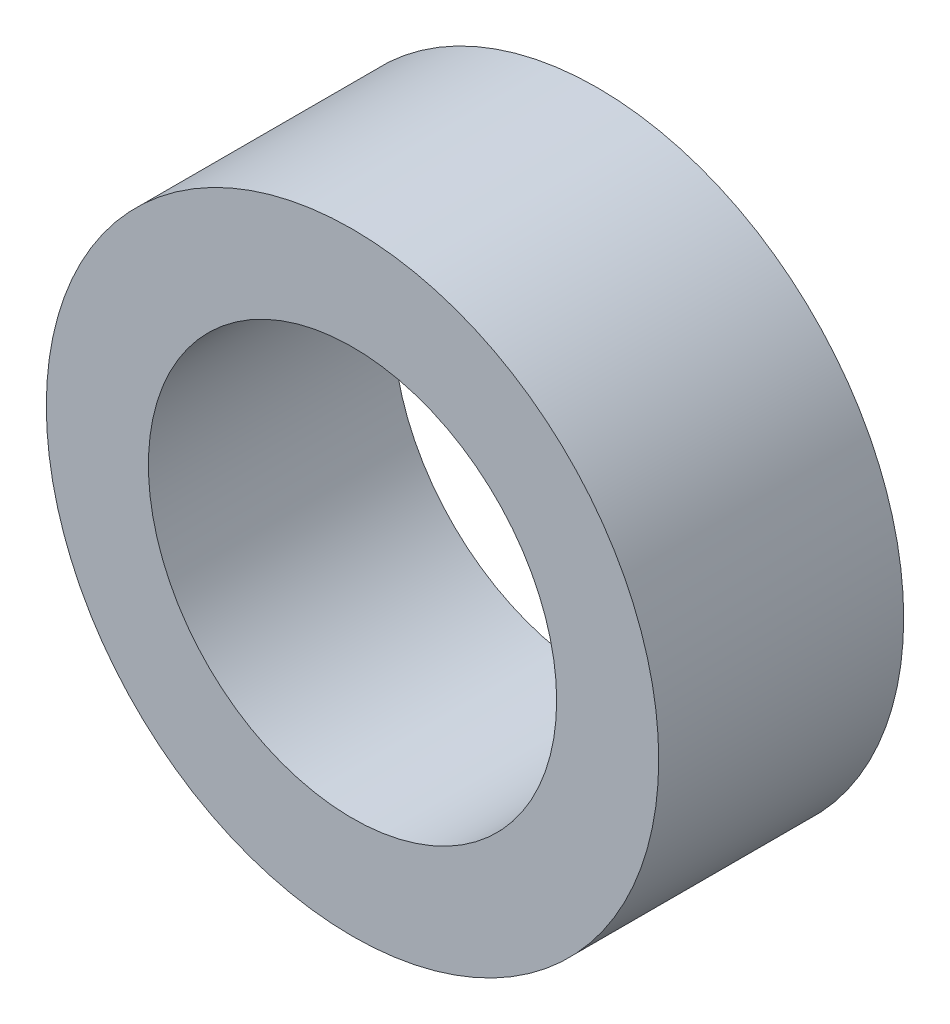
ISO-10303-21;
HEADER;
FILE_DESCRIPTION(('STEP AP214'),'2;1');
FILE_NAME('part.step','',(''),(''),'','','');
FILE_SCHEMA(('AUTOMOTIVE_DESIGN { 1 0 10303 214 1 1 1 1 }'));
ENDSEC;
DATA;
#1=APPLICATION_CONTEXT('core data for automotive mechanical design processes');
#2=APPLICATION_PROTOCOL_DEFINITION('international standard','automotive_design',2000,#1);
#3=PRODUCT_CONTEXT('',#1,'mechanical');
#4=PRODUCT('Part','Part','',(#3));
#5=PRODUCT_RELATED_PRODUCT_CATEGORY('part','',(#4));
#6=PRODUCT_DEFINITION_FORMATION('','',#4);
#7=PRODUCT_DEFINITION_CONTEXT('part definition',#1,'design');
#8=PRODUCT_DEFINITION('design','',#6,#7);
#9=PRODUCT_DEFINITION_SHAPE('','',#8);
#10=(LENGTH_UNIT() NAMED_UNIT(*) SI_UNIT(.MILLI.,.METRE.));
#11=(NAMED_UNIT(*) PLANE_ANGLE_UNIT() SI_UNIT($,.RADIAN.));
#12=(NAMED_UNIT(*) SI_UNIT($,.STERADIAN.) SOLID_ANGLE_UNIT());
#13=UNCERTAINTY_MEASURE_WITH_UNIT(LENGTH_MEASURE(1.E-05),#10,'distance_accuracy_value','');
#14=(GEOMETRIC_REPRESENTATION_CONTEXT(3) GLOBAL_UNCERTAINTY_ASSIGNED_CONTEXT((#13)) GLOBAL_UNIT_ASSIGNED_CONTEXT((#10,
#11,#12)) REPRESENTATION_CONTEXT('',''));
#15=CARTESIAN_POINT('',(0.,0.,0.));
#16=DIRECTION('',(0.,0.,1.));
#17=DIRECTION('',(1.,0.,0.));
#18=AXIS2_PLACEMENT_3D('',#15,#16,#17);
#19=CARTESIAN_POINT('',(0.,0.,1.5));
#20=DIRECTION('',(0.,0.,1.));
#21=DIRECTION('',(1.,0.,0.));
#22=AXIS2_PLACEMENT_3D('',#19,#20,#21);
#23=PLANE('',#22);
#24=CARTESIAN_POINT('',(0.,0.,1.5));
#25=DIRECTION('',(0.,0.,1.));
#26=DIRECTION('',(1.,0.,0.));
#27=AXIS2_PLACEMENT_3D('',#24,#25,#26);
#28=CIRCLE('',#27,3.75);
#29=CARTESIAN_POINT('',(3.75,0.,1.5));
#30=VERTEX_POINT('',#29);
#31=EDGE_CURVE('E10',#30,#30,#28,.T.);
#32=ORIENTED_EDGE('',*,*,#31,.T.);
#33=EDGE_LOOP('',(#32));
#34=FACE_BOUND('',#33,.T.);
#35=CARTESIAN_POINT('',(0.,0.,1.5));
#36=DIRECTION('',(0.,0.,1.));
#37=DIRECTION('',(1.,0.,0.));
#38=AXIS2_PLACEMENT_3D('',#35,#36,#37);
#39=CIRCLE('',#38,2.5);
#40=CARTESIAN_POINT('',(2.5,0.,1.5));
#41=VERTEX_POINT('',#40);
#42=EDGE_CURVE('E50',#41,#41,#39,.T.);
#43=ORIENTED_EDGE('',*,*,#42,.F.);
#44=EDGE_LOOP('',(#43));
#45=FACE_BOUND('',#44,.T.);
#46=ADVANCED_FACE('F37',(#34,#45),#23,.T.);
#47=CARTESIAN_POINT('',(0.,0.,-1.5));
#48=DIRECTION('',(0.,0.,1.));
#49=DIRECTION('',(1.,0.,0.));
#50=AXIS2_PLACEMENT_3D('',#47,#48,#49);
#51=PLANE('',#50);
#52=CARTESIAN_POINT('',(0.,0.,-1.5));
#53=DIRECTION('',(0.,0.,1.));
#54=DIRECTION('',(1.,0.,0.));
#55=AXIS2_PLACEMENT_3D('',#52,#53,#54);
#56=CIRCLE('',#55,3.75);
#57=CARTESIAN_POINT('',(3.75,0.,-1.5));
#58=VERTEX_POINT('',#57);
#59=EDGE_CURVE('E41',#58,#58,#56,.T.);
#60=ORIENTED_EDGE('',*,*,#59,.F.);
#61=EDGE_LOOP('',(#60));
#62=FACE_BOUND('',#61,.T.);
#63=CARTESIAN_POINT('',(0.,0.,-1.5));
#64=DIRECTION('',(0.,0.,1.));
#65=DIRECTION('',(1.,0.,0.));
#66=AXIS2_PLACEMENT_3D('',#63,#64,#65);
#67=CIRCLE('',#66,2.5);
#68=CARTESIAN_POINT('',(2.5,0.,-1.5));
#69=VERTEX_POINT('',#68);
#70=EDGE_CURVE('E52',#69,#69,#67,.T.);
#71=ORIENTED_EDGE('',*,*,#70,.T.);
#72=EDGE_LOOP('',(#71));
#73=FACE_BOUND('',#72,.T.);
#74=ADVANCED_FACE('F64',(#62,#73),#51,.F.);
#75=CARTESIAN_POINT('',(0.,0.,1.5));
#76=DIRECTION('',(0.,0.,-1.));
#77=DIRECTION('',(-1.,0.,0.));
#78=AXIS2_PLACEMENT_3D('',#75,#76,#77);
#79=CYLINDRICAL_SURFACE('',#78,3.75);
#80=ORIENTED_EDGE('',*,*,#31,.F.);
#81=EDGE_LOOP('',(#80));
#82=FACE_BOUND('',#81,.T.);
#83=ORIENTED_EDGE('',*,*,#59,.T.);
#84=EDGE_LOOP('',(#83));
#85=FACE_BOUND('',#84,.T.);
#86=ADVANCED_FACE('F39',(#82,#85),#79,.T.);
#87=CARTESIAN_POINT('',(0.,0.,1.5));
#88=DIRECTION('',(0.,0.,-1.));
#89=DIRECTION('',(-1.,0.,0.));
#90=AXIS2_PLACEMENT_3D('',#87,#88,#89);
#91=CYLINDRICAL_SURFACE('',#90,2.5);
#92=ORIENTED_EDGE('',*,*,#42,.T.);
#93=EDGE_LOOP('',(#92));
#94=FACE_BOUND('',#93,.T.);
#95=ORIENTED_EDGE('',*,*,#70,.F.);
#96=EDGE_LOOP('',(#95));
#97=FACE_BOUND('',#96,.T.);
#98=ADVANCED_FACE('F60',(#94,#97),#91,.F.);
#99=CLOSED_SHELL('',(#46,#74,#86,#98));
#100=MANIFOLD_SOLID_BREP('B2',#99);
#101=ADVANCED_BREP_SHAPE_REPRESENTATION('',(#18,#100),#14);
#102=SHAPE_DEFINITION_REPRESENTATION(#9,#101);
ENDSEC;
END-ISO-10303-21;
